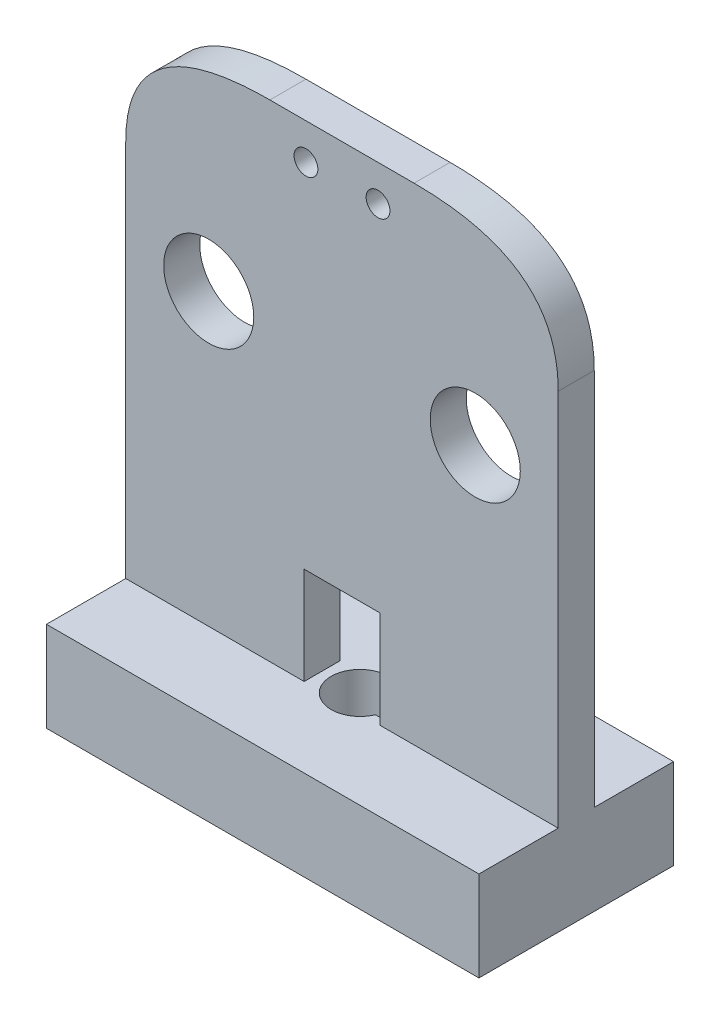
ISO-10303-21;
HEADER;
FILE_DESCRIPTION(('STEP AP214'),'2;1');
FILE_NAME('part.step','',(''),(''),'','','');
FILE_SCHEMA(('AUTOMOTIVE_DESIGN { 1 0 10303 214 1 1 1 1 }'));
ENDSEC;
DATA;
#1=APPLICATION_CONTEXT('core data for automotive mechanical design processes');
#2=APPLICATION_PROTOCOL_DEFINITION('international standard','automotive_design',2000,#1);
#3=PRODUCT_CONTEXT('',#1,'mechanical');
#4=PRODUCT('Part','Part','',(#3));
#5=PRODUCT_RELATED_PRODUCT_CATEGORY('part','',(#4));
#6=PRODUCT_DEFINITION_FORMATION('','',#4);
#7=PRODUCT_DEFINITION_CONTEXT('part definition',#1,'design');
#8=PRODUCT_DEFINITION('design','',#6,#7);
#9=PRODUCT_DEFINITION_SHAPE('','',#8);
#10=(LENGTH_UNIT() NAMED_UNIT(*) SI_UNIT(.MILLI.,.METRE.));
#11=(NAMED_UNIT(*) PLANE_ANGLE_UNIT() SI_UNIT($,.RADIAN.));
#12=(NAMED_UNIT(*) SI_UNIT($,.STERADIAN.) SOLID_ANGLE_UNIT());
#13=UNCERTAINTY_MEASURE_WITH_UNIT(LENGTH_MEASURE(1.E-05),#10,'distance_accuracy_value','');
#14=(GEOMETRIC_REPRESENTATION_CONTEXT(3) GLOBAL_UNCERTAINTY_ASSIGNED_CONTEXT((#13)) GLOBAL_UNIT_ASSIGNED_CONTEXT((#10,
#11,#12)) REPRESENTATION_CONTEXT('',''));
#15=CARTESIAN_POINT('',(0.,0.,0.));
#16=DIRECTION('',(0.,0.,1.));
#17=DIRECTION('',(1.,0.,0.));
#18=AXIS2_PLACEMENT_3D('',#15,#16,#17);
#19=CARTESIAN_POINT('',(0.,0.,5.));
#20=DIRECTION('',(0.,0.,1.));
#21=DIRECTION('',(1.,0.,0.));
#22=AXIS2_PLACEMENT_3D('',#19,#20,#21);
#23=PLANE('',#22);
#24=CARTESIAN_POINT('',(-18.4881047121735,12.7722913625034,5.));
#25=DIRECTION('',(0.,0.,1.));
#26=DIRECTION('',(1.,0.,0.));
#27=AXIS2_PLACEMENT_3D('',#24,#25,#26);
#28=CIRCLE('',#27,6.25);
#29=CARTESIAN_POINT('',(-12.2381047121735,12.7722913625034,5.));
#30=VERTEX_POINT('',#29);
#31=EDGE_CURVE('E455',#30,#30,#28,.T.);
#32=ORIENTED_EDGE('',*,*,#31,.F.);
#33=EDGE_LOOP('',(#32));
#34=FACE_BOUND('',#33,.T.);
#35=CARTESIAN_POINT('',(18.4881047121735,12.7722913625034,5.));
#36=DIRECTION('',(0.,0.,1.));
#37=DIRECTION('',(1.,0.,0.));
#38=AXIS2_PLACEMENT_3D('',#35,#36,#37);
#39=CIRCLE('',#38,6.25);
#40=CARTESIAN_POINT('',(24.7381047121735,12.7722913625034,5.));
#41=VERTEX_POINT('',#40);
#42=EDGE_CURVE('E457',#41,#41,#39,.T.);
#43=ORIENTED_EDGE('',*,*,#42,.F.);
#44=EDGE_LOOP('',(#43));
#45=FACE_BOUND('',#44,.T.);
#46=CARTESIAN_POINT('',(5.,35.,5.));
#47=DIRECTION('',(0.,0.,1.));
#48=DIRECTION('',(1.,0.,0.));
#49=AXIS2_PLACEMENT_3D('',#46,#47,#48);
#50=CIRCLE('',#49,1.65);
#51=CARTESIAN_POINT('',(6.65,35.,5.));
#52=VERTEX_POINT('',#51);
#53=EDGE_CURVE('E462',#52,#52,#50,.T.);
#54=ORIENTED_EDGE('',*,*,#53,.F.);
#55=EDGE_LOOP('',(#54));
#56=FACE_BOUND('',#55,.T.);
#57=CARTESIAN_POINT('',(-5.,35.,5.));
#58=DIRECTION('',(0.,0.,1.));
#59=DIRECTION('',(1.,0.,0.));
#60=AXIS2_PLACEMENT_3D('',#57,#58,#59);
#61=CIRCLE('',#60,1.65);
#62=CARTESIAN_POINT('',(-3.35,35.,5.));
#63=VERTEX_POINT('',#62);
#64=EDGE_CURVE('E215',#63,#63,#61,.T.);
#65=ORIENTED_EDGE('',*,*,#64,.F.);
#66=EDGE_LOOP('',(#65));
#67=FACE_BOUND('',#66,.T.);
#68=DIRECTION('',(-1.,0.,0.));
#69=VECTOR('',#68,1.);
#70=CARTESIAN_POINT('',(0.,-27.5,5.));
#71=LINE('',#70,#69);
#72=CARTESIAN_POINT('',(-5.25,-27.5,5.));
#73=VERTEX_POINT('',#72);
#74=CARTESIAN_POINT('',(-30.,-27.5,5.));
#75=VERTEX_POINT('',#74);
#76=EDGE_CURVE('E477',#73,#75,#71,.T.);
#77=ORIENTED_EDGE('',*,*,#76,.F.);
#78=DIRECTION('',(0.,1.,0.));
#79=VECTOR('',#78,1.);
#80=CARTESIAN_POINT('',(-5.25,0.,5.));
#81=LINE('',#80,#79);
#82=CARTESIAN_POINT('',(-5.25,-14.,5.));
#83=VERTEX_POINT('',#82);
#84=EDGE_CURVE('E182',#73,#83,#81,.T.);
#85=ORIENTED_EDGE('',*,*,#84,.T.);
#86=DIRECTION('',(-1.,0.,0.));
#87=VECTOR('',#86,1.);
#88=CARTESIAN_POINT('',(0.,-14.,5.));
#89=LINE('',#88,#87);
#90=CARTESIAN_POINT('',(5.25,-14.,5.));
#91=VERTEX_POINT('',#90);
#92=EDGE_CURVE('E529',#91,#83,#89,.T.);
#93=ORIENTED_EDGE('',*,*,#92,.F.);
#94=DIRECTION('',(0.,-1.,0.));
#95=VECTOR('',#94,1.);
#96=CARTESIAN_POINT('',(5.25,0.,5.));
#97=LINE('',#96,#95);
#98=CARTESIAN_POINT('',(5.25,-27.5,5.));
#99=VERTEX_POINT('',#98);
#100=EDGE_CURVE('E194',#91,#99,#97,.T.);
#101=ORIENTED_EDGE('',*,*,#100,.T.);
#102=CARTESIAN_POINT('',(30.,-27.5,5.));
#103=VERTEX_POINT('',#102);
#104=EDGE_CURVE('E465',#103,#99,#71,.T.);
#105=ORIENTED_EDGE('',*,*,#104,.F.);
#106=DIRECTION('',(0.,1.,0.));
#107=VECTOR('',#106,1.);
#108=CARTESIAN_POINT('',(30.,0.,5.));
#109=LINE('',#108,#107);
#110=CARTESIAN_POINT('',(30.,25.,5.));
#111=VERTEX_POINT('',#110);
#112=EDGE_CURVE('E211',#103,#111,#109,.T.);
#113=ORIENTED_EDGE('',*,*,#112,.T.);
#114=CARTESIAN_POINT('',(10.,40.,5.));
#115=CARTESIAN_POINT('',(30.,40.,5.));
#116=CARTESIAN_POINT('',(30.,25.,5.));
#117=(BOUNDED_CURVE() B_SPLINE_CURVE(2,(#114,#115,#116),.UNSPECIFIED.,.F.,
.F.) B_SPLINE_CURVE_WITH_KNOTS((3,3),(0.,1.),
.UNSPECIFIED.) CURVE() GEOMETRIC_REPRESENTATION_ITEM() RATIONAL_B_SPLINE_CURVE((1.,1.,1.)) REPRESENTATION_ITEM(''));
#118=CARTESIAN_POINT('',(10.,40.,5.));
#119=VERTEX_POINT('',#118);
#120=EDGE_CURVE('E205',#111,#119,#117,.F.);
#121=ORIENTED_EDGE('',*,*,#120,.T.);
#122=DIRECTION('',(1.,0.,0.));
#123=VECTOR('',#122,1.);
#124=CARTESIAN_POINT('',(0.,40.,5.));
#125=LINE('',#124,#123);
#126=CARTESIAN_POINT('',(-10.,40.,5.));
#127=VERTEX_POINT('',#126);
#128=EDGE_CURVE('E214',#127,#119,#125,.T.);
#129=ORIENTED_EDGE('',*,*,#128,.F.);
#130=CARTESIAN_POINT('',(-30.,25.,5.));
#131=CARTESIAN_POINT('',(-30.,40.,5.));
#132=CARTESIAN_POINT('',(-10.,40.,5.));
#133=(BOUNDED_CURVE() B_SPLINE_CURVE(2,(#130,#131,#132),.UNSPECIFIED.,.F.,
.F.) B_SPLINE_CURVE_WITH_KNOTS((3,3),(0.,1.),
.UNSPECIFIED.) CURVE() GEOMETRIC_REPRESENTATION_ITEM() RATIONAL_B_SPLINE_CURVE((1.,1.,1.)) REPRESENTATION_ITEM(''));
#134=CARTESIAN_POINT('',(-30.,25.,5.));
#135=VERTEX_POINT('',#134);
#136=EDGE_CURVE('E321',#127,#135,#133,.F.);
#137=ORIENTED_EDGE('',*,*,#136,.T.);
#138=DIRECTION('',(0.,1.,0.));
#139=VECTOR('',#138,1.);
#140=CARTESIAN_POINT('',(-30.,0.,5.));
#141=LINE('',#140,#139);
#142=EDGE_CURVE('E216',#75,#135,#141,.T.);
#143=ORIENTED_EDGE('',*,*,#142,.F.);
#144=EDGE_LOOP('',(#77,#85,#93,#101,#105,#113,#121,#129,#137,#143));
#145=FACE_BOUND('',#144,.T.);
#146=ADVANCED_FACE('F46',(#34,#45,#56,#67,#145),#23,.T.);
#147=CARTESIAN_POINT('',(0.,0.,0.));
#148=DIRECTION('',(0.,0.,1.));
#149=DIRECTION('',(1.,0.,0.));
#150=AXIS2_PLACEMENT_3D('',#147,#148,#149);
#151=PLANE('',#150);
#152=CARTESIAN_POINT('',(-5.,35.,0.));
#153=DIRECTION('',(0.,0.,1.));
#154=DIRECTION('',(1.,0.,0.));
#155=AXIS2_PLACEMENT_3D('',#152,#153,#154);
#156=CIRCLE('',#155,1.65);
#157=CARTESIAN_POINT('',(-3.35,35.,0.));
#158=VERTEX_POINT('',#157);
#159=EDGE_CURVE('E441',#158,#158,#156,.T.);
#160=ORIENTED_EDGE('',*,*,#159,.T.);
#161=EDGE_LOOP('',(#160));
#162=FACE_BOUND('',#161,.T.);
#163=CARTESIAN_POINT('',(5.,35.,0.));
#164=DIRECTION('',(0.,0.,1.));
#165=DIRECTION('',(1.,0.,0.));
#166=AXIS2_PLACEMENT_3D('',#163,#164,#165);
#167=CIRCLE('',#166,1.65);
#168=CARTESIAN_POINT('',(6.65,35.,0.));
#169=VERTEX_POINT('',#168);
#170=EDGE_CURVE('E591',#169,#169,#167,.T.);
#171=ORIENTED_EDGE('',*,*,#170,.T.);
#172=EDGE_LOOP('',(#171));
#173=FACE_BOUND('',#172,.T.);
#174=CARTESIAN_POINT('',(18.4881047121735,12.7722913625034,0.));
#175=DIRECTION('',(0.,0.,1.));
#176=DIRECTION('',(1.,0.,0.));
#177=AXIS2_PLACEMENT_3D('',#174,#175,#176);
#178=CIRCLE('',#177,6.25);
#179=CARTESIAN_POINT('',(24.7381047121735,12.7722913625034,0.));
#180=VERTEX_POINT('',#179);
#181=EDGE_CURVE('E589',#180,#180,#178,.T.);
#182=ORIENTED_EDGE('',*,*,#181,.T.);
#183=EDGE_LOOP('',(#182));
#184=FACE_BOUND('',#183,.T.);
#185=CARTESIAN_POINT('',(-18.4881047121735,12.7722913625034,0.));
#186=DIRECTION('',(0.,0.,1.));
#187=DIRECTION('',(1.,0.,0.));
#188=AXIS2_PLACEMENT_3D('',#185,#186,#187);
#189=CIRCLE('',#188,6.25);
#190=CARTESIAN_POINT('',(-12.2381047121735,12.7722913625034,0.));
#191=VERTEX_POINT('',#190);
#192=EDGE_CURVE('E481',#191,#191,#189,.T.);
#193=ORIENTED_EDGE('',*,*,#192,.T.);
#194=EDGE_LOOP('',(#193));
#195=FACE_BOUND('',#194,.T.);
#196=DIRECTION('',(0.,1.,0.));
#197=VECTOR('',#196,1.);
#198=CARTESIAN_POINT('',(-5.25,0.,0.));
#199=LINE('',#198,#197);
#200=CARTESIAN_POINT('',(-5.25,-27.5,0.));
#201=VERTEX_POINT('',#200);
#202=CARTESIAN_POINT('',(-5.25,-14.,0.));
#203=VERTEX_POINT('',#202);
#204=EDGE_CURVE('E179',#201,#203,#199,.T.);
#205=ORIENTED_EDGE('',*,*,#204,.F.);
#206=DIRECTION('',(-1.,0.,0.));
#207=VECTOR('',#206,1.);
#208=CARTESIAN_POINT('',(0.,-27.5,0.));
#209=LINE('',#208,#207);
#210=CARTESIAN_POINT('',(-30.,-27.5,0.));
#211=VERTEX_POINT('',#210);
#212=EDGE_CURVE('E191',#201,#211,#209,.T.);
#213=ORIENTED_EDGE('',*,*,#212,.T.);
#214=DIRECTION('',(0.,1.,0.));
#215=VECTOR('',#214,1.);
#216=CARTESIAN_POINT('',(-30.,0.,0.));
#217=LINE('',#216,#215);
#218=CARTESIAN_POINT('',(-30.,25.,0.));
#219=VERTEX_POINT('',#218);
#220=EDGE_CURVE('E208',#211,#219,#217,.T.);
#221=ORIENTED_EDGE('',*,*,#220,.T.);
#222=CARTESIAN_POINT('',(-10.,40.,0.));
#223=CARTESIAN_POINT('',(-30.,40.,0.));
#224=CARTESIAN_POINT('',(-30.,25.,0.));
#225=(BOUNDED_CURVE() B_SPLINE_CURVE(2,(#222,#223,#224),.UNSPECIFIED.,.F.,
.F.) B_SPLINE_CURVE_WITH_KNOTS((3,3),(0.,1.),
.UNSPECIFIED.) CURVE() GEOMETRIC_REPRESENTATION_ITEM() RATIONAL_B_SPLINE_CURVE((1.,1.,1.)) REPRESENTATION_ITEM(''));
#226=CARTESIAN_POINT('',(-10.,40.,0.));
#227=VERTEX_POINT('',#226);
#228=EDGE_CURVE('E274',#219,#227,#225,.F.);
#229=ORIENTED_EDGE('',*,*,#228,.T.);
#230=DIRECTION('',(1.,0.,0.));
#231=VECTOR('',#230,1.);
#232=CARTESIAN_POINT('',(0.,40.,0.));
#233=LINE('',#232,#231);
#234=CARTESIAN_POINT('',(10.,40.,0.));
#235=VERTEX_POINT('',#234);
#236=EDGE_CURVE('E230',#227,#235,#233,.T.);
#237=ORIENTED_EDGE('',*,*,#236,.T.);
#238=CARTESIAN_POINT('',(30.,25.,0.));
#239=CARTESIAN_POINT('',(30.,40.,0.));
#240=CARTESIAN_POINT('',(9.99999999999999,40.,0.));
#241=(BOUNDED_CURVE() B_SPLINE_CURVE(2,(#238,#239,#240),.UNSPECIFIED.,.F.,
.F.) B_SPLINE_CURVE_WITH_KNOTS((3,3),(0.,1.),
.UNSPECIFIED.) CURVE() GEOMETRIC_REPRESENTATION_ITEM() RATIONAL_B_SPLINE_CURVE((1.,1.,1.)) REPRESENTATION_ITEM(''));
#242=CARTESIAN_POINT('',(30.,25.,0.));
#243=VERTEX_POINT('',#242);
#244=EDGE_CURVE('E353',#235,#243,#241,.F.);
#245=ORIENTED_EDGE('',*,*,#244,.T.);
#246=DIRECTION('',(0.,1.,0.));
#247=VECTOR('',#246,1.);
#248=CARTESIAN_POINT('',(30.,0.,0.));
#249=LINE('',#248,#247);
#250=CARTESIAN_POINT('',(30.,-27.5,0.));
#251=VERTEX_POINT('',#250);
#252=EDGE_CURVE('E434',#251,#243,#249,.T.);
#253=ORIENTED_EDGE('',*,*,#252,.F.);
#254=CARTESIAN_POINT('',(5.25,-27.5,0.));
#255=VERTEX_POINT('',#254);
#256=EDGE_CURVE('E200',#251,#255,#209,.T.);
#257=ORIENTED_EDGE('',*,*,#256,.T.);
#258=DIRECTION('',(0.,-1.,0.));
#259=VECTOR('',#258,1.);
#260=CARTESIAN_POINT('',(5.25,0.,0.));
#261=LINE('',#260,#259);
#262=CARTESIAN_POINT('',(5.25,-14.,0.));
#263=VERTEX_POINT('',#262);
#264=EDGE_CURVE('E534',#263,#255,#261,.T.);
#265=ORIENTED_EDGE('',*,*,#264,.F.);
#266=DIRECTION('',(-1.,0.,0.));
#267=VECTOR('',#266,1.);
#268=CARTESIAN_POINT('',(0.,-14.,0.));
#269=LINE('',#268,#267);
#270=EDGE_CURVE('E12',#263,#203,#269,.T.);
#271=ORIENTED_EDGE('',*,*,#270,.T.);
#272=EDGE_LOOP('',(#205,#213,#221,#229,#237,#245,#253,#257,#265,#271));
#273=FACE_BOUND('',#272,.T.);
#274=ADVANCED_FACE('F190',(#162,#173,#184,#195,#273),#151,.F.);
#275=CARTESIAN_POINT('',(0.,-27.,2.5));
#276=DIRECTION('',(0.,-1.,0.));
#277=DIRECTION('',(0.,0.,-1.));
#278=AXIS2_PLACEMENT_3D('',#275,#276,#277);
#279=CYLINDRICAL_SURFACE('',#278,4.);
#280=DIRECTION('',(0.,-1.,0.));
#281=VECTOR('',#280,1.);
#282=CARTESIAN_POINT('',(3.68747881349846,-27.,0.95));
#283=LINE('',#282,#281);
#284=CARTESIAN_POINT('',(3.68747881349846,-27.5,0.95));
#285=VERTEX_POINT('',#284);
#286=CARTESIAN_POINT('',(3.68747881349846,-40.,0.95));
#287=VERTEX_POINT('',#286);
#288=EDGE_CURVE('E72',#285,#287,#283,.T.);
#289=ORIENTED_EDGE('',*,*,#288,.F.);
#290=CARTESIAN_POINT('',(0.,-27.5,2.5));
#291=DIRECTION('',(0.,1.,0.));
#292=DIRECTION('',(0.,0.,1.));
#293=AXIS2_PLACEMENT_3D('',#290,#291,#292);
#294=CIRCLE('',#293,4.);
#295=CARTESIAN_POINT('',(3.68747881349846,-27.5,4.05));
#296=VERTEX_POINT('',#295);
#297=EDGE_CURVE('E65',#285,#296,#294,.T.);
#298=ORIENTED_EDGE('',*,*,#297,.T.);
#299=DIRECTION('',(0.,-1.,0.));
#300=VECTOR('',#299,1.);
#301=CARTESIAN_POINT('',(3.68747881349846,-27.,4.05));
#302=LINE('',#301,#300);
#303=CARTESIAN_POINT('',(3.68747881349846,-40.,4.05));
#304=VERTEX_POINT('',#303);
#305=EDGE_CURVE('E512',#296,#304,#302,.T.);
#306=ORIENTED_EDGE('',*,*,#305,.T.);
#307=CARTESIAN_POINT('',(0.,-40.,2.5));
#308=DIRECTION('',(0.,-1.,0.));
#309=DIRECTION('',(0.,0.,-1.));
#310=AXIS2_PLACEMENT_3D('',#307,#308,#309);
#311=CIRCLE('',#310,4.);
#312=EDGE_CURVE('E527',#304,#287,#311,.T.);
#313=ORIENTED_EDGE('',*,*,#312,.T.);
#314=EDGE_LOOP('',(#289,#298,#306,#313));
#315=FACE_BOUND('',#314,.T.);
#316=ADVANCED_FACE('F288',(#315),#279,.F.);
#317=CARTESIAN_POINT('',(0.,-27.,4.05));
#318=DIRECTION('',(0.,0.,-1.));
#319=DIRECTION('',(-1.,0.,0.));
#320=AXIS2_PLACEMENT_3D('',#317,#318,#319);
#321=PLANE('',#320);
#322=ORIENTED_EDGE('',*,*,#305,.F.);
#323=DIRECTION('',(1.,0.,0.));
#324=VECTOR('',#323,1.);
#325=CARTESIAN_POINT('',(0.,-27.5,4.05));
#326=LINE('',#325,#324);
#327=CARTESIAN_POINT('',(5.2,-27.5,4.05));
#328=VERTEX_POINT('',#327);
#329=EDGE_CURVE('E536',#296,#328,#326,.T.);
#330=ORIENTED_EDGE('',*,*,#329,.T.);
#331=DIRECTION('',(0.,-1.,0.));
#332=VECTOR('',#331,1.);
#333=CARTESIAN_POINT('',(5.2,-27.,4.05));
#334=LINE('',#333,#332);
#335=CARTESIAN_POINT('',(5.2,-40.,4.05));
#336=VERTEX_POINT('',#335);
#337=EDGE_CURVE('E517',#328,#336,#334,.T.);
#338=ORIENTED_EDGE('',*,*,#337,.T.);
#339=DIRECTION('',(1.,0.,0.));
#340=VECTOR('',#339,1.);
#341=CARTESIAN_POINT('',(0.,-40.,4.05));
#342=LINE('',#341,#340);
#343=EDGE_CURVE('E515',#304,#336,#342,.T.);
#344=ORIENTED_EDGE('',*,*,#343,.F.);
#345=EDGE_LOOP('',(#322,#330,#338,#344));
#346=FACE_BOUND('',#345,.T.);
#347=ADVANCED_FACE('F644',(#346),#321,.T.);
#348=CARTESIAN_POINT('',(5.2,-27.,0.));
#349=DIRECTION('',(1.,0.,0.));
#350=DIRECTION('',(0.,0.,-1.));
#351=AXIS2_PLACEMENT_3D('',#348,#349,#350);
#352=PLANE('',#351);
#353=DIRECTION('',(0.,0.,1.));
#354=VECTOR('',#353,1.);
#355=CARTESIAN_POINT('',(5.2,-27.5,0.));
#356=LINE('',#355,#354);
#357=CARTESIAN_POINT('',(5.2,-27.5,0.95));
#358=VERTEX_POINT('',#357);
#359=EDGE_CURVE('E539',#358,#328,#356,.T.);
#360=ORIENTED_EDGE('',*,*,#359,.F.);
#361=DIRECTION('',(0.,-1.,0.));
#362=VECTOR('',#361,1.);
#363=CARTESIAN_POINT('',(5.2,-27.,0.95));
#364=LINE('',#363,#362);
#365=CARTESIAN_POINT('',(5.2,-40.,0.95));
#366=VERTEX_POINT('',#365);
#367=EDGE_CURVE('E514',#358,#366,#364,.T.);
#368=ORIENTED_EDGE('',*,*,#367,.T.);
#369=DIRECTION('',(0.,0.,1.));
#370=VECTOR('',#369,1.);
#371=CARTESIAN_POINT('',(5.2,-40.,0.));
#372=LINE('',#371,#370);
#373=EDGE_CURVE('E522',#366,#336,#372,.T.);
#374=ORIENTED_EDGE('',*,*,#373,.T.);
#375=ORIENTED_EDGE('',*,*,#337,.F.);
#376=EDGE_LOOP('',(#360,#368,#374,#375));
#377=FACE_BOUND('',#376,.T.);
#378=ADVANCED_FACE('F571',(#377),#352,.F.);
#379=CARTESIAN_POINT('',(0.,-27.,0.95));
#380=DIRECTION('',(0.,0.,-1.));
#381=DIRECTION('',(-1.,0.,0.));
#382=AXIS2_PLACEMENT_3D('',#379,#380,#381);
#383=PLANE('',#382);
#384=DIRECTION('',(1.,0.,0.));
#385=VECTOR('',#384,1.);
#386=CARTESIAN_POINT('',(0.,-27.5,0.95));
#387=LINE('',#386,#385);
#388=EDGE_CURVE('E58',#285,#358,#387,.T.);
#389=ORIENTED_EDGE('',*,*,#388,.F.);
#390=ORIENTED_EDGE('',*,*,#288,.T.);
#391=DIRECTION('',(1.,0.,0.));
#392=VECTOR('',#391,1.);
#393=CARTESIAN_POINT('',(0.,-40.,0.95));
#394=LINE('',#393,#392);
#395=EDGE_CURVE('E525',#287,#366,#394,.T.);
#396=ORIENTED_EDGE('',*,*,#395,.T.);
#397=ORIENTED_EDGE('',*,*,#367,.F.);
#398=EDGE_LOOP('',(#389,#390,#396,#397));
#399=FACE_BOUND('',#398,.T.);
#400=ADVANCED_FACE('F565',(#399),#383,.F.);
#401=CARTESIAN_POINT('',(0.,-40.,5.));
#402=DIRECTION('',(0.,1.,0.));
#403=DIRECTION('',(0.,0.,1.));
#404=AXIS2_PLACEMENT_3D('',#401,#402,#403);
#405=PLANE('',#404);
#406=ORIENTED_EDGE('',*,*,#395,.F.);
#407=ORIENTED_EDGE('',*,*,#312,.F.);
#408=ORIENTED_EDGE('',*,*,#343,.T.);
#409=ORIENTED_EDGE('',*,*,#373,.F.);
#410=EDGE_LOOP('',(#406,#407,#408,#409));
#411=FACE_BOUND('',#410,.T.);
#412=DIRECTION('',(0.,0.,-1.));
#413=VECTOR('',#412,1.);
#414=CARTESIAN_POINT('',(-30.,-40.,5.));
#415=LINE('',#414,#413);
#416=CARTESIAN_POINT('',(-30.,-40.,16.));
#417=VERTEX_POINT('',#416);
#418=CARTESIAN_POINT('',(-30.,-40.,-11.));
#419=VERTEX_POINT('',#418);
#420=EDGE_CURVE('E448',#417,#419,#415,.T.);
#421=ORIENTED_EDGE('',*,*,#420,.T.);
#422=DIRECTION('',(1.,0.,0.));
#423=VECTOR('',#422,1.);
#424=CARTESIAN_POINT('',(-30.,-40.,-11.));
#425=LINE('',#424,#423);
#426=CARTESIAN_POINT('',(30.,-40.,-11.));
#427=VERTEX_POINT('',#426);
#428=EDGE_CURVE('E494',#419,#427,#425,.T.);
#429=ORIENTED_EDGE('',*,*,#428,.T.);
#430=DIRECTION('',(0.,0.,-1.));
#431=VECTOR('',#430,1.);
#432=CARTESIAN_POINT('',(30.,-40.,5.));
#433=LINE('',#432,#431);
#434=CARTESIAN_POINT('',(30.,-40.,16.));
#435=VERTEX_POINT('',#434);
#436=EDGE_CURVE('E449',#435,#427,#433,.T.);
#437=ORIENTED_EDGE('',*,*,#436,.F.);
#438=DIRECTION('',(1.,0.,0.));
#439=VECTOR('',#438,1.);
#440=CARTESIAN_POINT('',(-30.,-40.,16.));
#441=LINE('',#440,#439);
#442=EDGE_CURVE('E506',#417,#435,#441,.T.);
#443=ORIENTED_EDGE('',*,*,#442,.F.);
#444=EDGE_LOOP('',(#421,#429,#437,#443));
#445=FACE_BOUND('',#444,.T.);
#446=ADVANCED_FACE('F558',(#411,#445),#405,.F.);
#447=CARTESIAN_POINT('',(30.,0.,5.));
#448=DIRECTION('',(-1.,0.,0.));
#449=DIRECTION('',(0.,0.,1.));
#450=AXIS2_PLACEMENT_3D('',#447,#448,#449);
#451=PLANE('',#450);
#452=ORIENTED_EDGE('',*,*,#112,.F.);
#453=DIRECTION('',(0.,0.,1.));
#454=VECTOR('',#453,1.);
#455=CARTESIAN_POINT('',(30.,-27.5,-11.));
#456=LINE('',#455,#454);
#457=CARTESIAN_POINT('',(30.,-27.5,16.));
#458=VERTEX_POINT('',#457);
#459=EDGE_CURVE('E489',#103,#458,#456,.T.);
#460=ORIENTED_EDGE('',*,*,#459,.T.);
#461=DIRECTION('',(0.,1.,0.));
#462=VECTOR('',#461,1.);
#463=CARTESIAN_POINT('',(30.,-40.,16.));
#464=LINE('',#463,#462);
#465=EDGE_CURVE('E504',#435,#458,#464,.T.);
#466=ORIENTED_EDGE('',*,*,#465,.F.);
#467=ORIENTED_EDGE('',*,*,#436,.T.);
#468=DIRECTION('',(0.,1.,0.));
#469=VECTOR('',#468,1.);
#470=CARTESIAN_POINT('',(30.,-40.,-11.));
#471=LINE('',#470,#469);
#472=CARTESIAN_POINT('',(30.,-27.5,-11.));
#473=VERTEX_POINT('',#472);
#474=EDGE_CURVE('E492',#427,#473,#471,.T.);
#475=ORIENTED_EDGE('',*,*,#474,.T.);
#476=EDGE_CURVE('E484',#473,#251,#456,.T.);
#477=ORIENTED_EDGE('',*,*,#476,.T.);
#478=ORIENTED_EDGE('',*,*,#252,.T.);
#479=CARTESIAN_POINT('',(30.,25.,5.25));
#480=CARTESIAN_POINT('',(30.,25.,3.41666666666667));
#481=CARTESIAN_POINT('',(30.,25.,1.58333333333333));
#482=CARTESIAN_POINT('',(30.,25.,-0.25));
#483=(BOUNDED_CURVE() B_SPLINE_CURVE(3,(#479,#480,#481,#482),.UNSPECIFIED.,.F.,
.F.) B_SPLINE_CURVE_WITH_KNOTS((4,4),(-0.00525,0.00025),
.UNSPECIFIED.) CURVE() GEOMETRIC_REPRESENTATION_ITEM() RATIONAL_B_SPLINE_CURVE((1.,1.,1.,1.)) REPRESENTATION_ITEM(''));
#484=EDGE_CURVE('E306',#243,#111,#483,.F.);
#485=ORIENTED_EDGE('',*,*,#484,.T.);
#486=EDGE_LOOP('',(#452,#460,#466,#467,#475,#477,#478,#485));
#487=FACE_BOUND('',#486,.T.);
#488=ADVANCED_FACE('F256',(#487),#451,.F.);
#489=CARTESIAN_POINT('',(0.,40.,5.));
#490=DIRECTION('',(0.,1.,0.));
#491=DIRECTION('',(0.,0.,1.));
#492=AXIS2_PLACEMENT_3D('',#489,#490,#491);
#493=PLANE('',#492);
#494=ORIENTED_EDGE('',*,*,#128,.T.);
#495=CARTESIAN_POINT('',(10.,40.,-0.25));
#496=CARTESIAN_POINT('',(10.,40.,1.58333333333333));
#497=CARTESIAN_POINT('',(10.,40.,3.41666666666667));
#498=CARTESIAN_POINT('',(10.,40.,5.25));
#499=(BOUNDED_CURVE() B_SPLINE_CURVE(3,(#495,#496,#497,#498),.UNSPECIFIED.,.F.,
.F.) B_SPLINE_CURVE_WITH_KNOTS((4,4),(-0.00525,0.00025),
.UNSPECIFIED.) CURVE() GEOMETRIC_REPRESENTATION_ITEM() RATIONAL_B_SPLINE_CURVE((1.,1.,1.,1.)) REPRESENTATION_ITEM(''));
#500=EDGE_CURVE('E453',#119,#235,#499,.F.);
#501=ORIENTED_EDGE('',*,*,#500,.T.);
#502=ORIENTED_EDGE('',*,*,#236,.F.);
#503=CARTESIAN_POINT('',(-10.,40.,5.25));
#504=CARTESIAN_POINT('',(-10.,40.,3.41666666666666));
#505=CARTESIAN_POINT('',(-10.,40.,1.58333333333334));
#506=CARTESIAN_POINT('',(-10.,40.,-0.25));
#507=(BOUNDED_CURVE() B_SPLINE_CURVE(3,(#503,#504,#505,#506),.UNSPECIFIED.,.F.,
.F.) B_SPLINE_CURVE_WITH_KNOTS((4,4),(-0.00025,0.00525),
.UNSPECIFIED.) CURVE() GEOMETRIC_REPRESENTATION_ITEM() RATIONAL_B_SPLINE_CURVE((1.,1.,1.,1.)) REPRESENTATION_ITEM(''));
#508=EDGE_CURVE('E237',#227,#127,#507,.F.);
#509=ORIENTED_EDGE('',*,*,#508,.T.);
#510=EDGE_LOOP('',(#494,#501,#502,#509));
#511=FACE_BOUND('',#510,.T.);
#512=ADVANCED_FACE('F245',(#511),#493,.T.);
#513=CARTESIAN_POINT('',(-5.,35.,5.));
#514=DIRECTION('',(0.,0.,-1.));
#515=DIRECTION('',(-1.,0.,0.));
#516=AXIS2_PLACEMENT_3D('',#513,#514,#515);
#517=CYLINDRICAL_SURFACE('',#516,1.65);
#518=ORIENTED_EDGE('',*,*,#64,.T.);
#519=EDGE_LOOP('',(#518));
#520=FACE_BOUND('',#519,.T.);
#521=ORIENTED_EDGE('',*,*,#159,.F.);
#522=EDGE_LOOP('',(#521));
#523=FACE_BOUND('',#522,.T.);
#524=ADVANCED_FACE('F255',(#520,#523),#517,.F.);
#525=CARTESIAN_POINT('',(5.,35.,5.));
#526=DIRECTION('',(0.,0.,-1.));
#527=DIRECTION('',(-1.,0.,0.));
#528=AXIS2_PLACEMENT_3D('',#525,#526,#527);
#529=CYLINDRICAL_SURFACE('',#528,1.65);
#530=ORIENTED_EDGE('',*,*,#53,.T.);
#531=EDGE_LOOP('',(#530));
#532=FACE_BOUND('',#531,.T.);
#533=ORIENTED_EDGE('',*,*,#170,.F.);
#534=EDGE_LOOP('',(#533));
#535=FACE_BOUND('',#534,.T.);
#536=ADVANCED_FACE('F577',(#532,#535),#529,.F.);
#537=CARTESIAN_POINT('',(18.4881047121735,12.7722913625034,5.));
#538=DIRECTION('',(0.,0.,-1.));
#539=DIRECTION('',(-1.,0.,0.));
#540=AXIS2_PLACEMENT_3D('',#537,#538,#539);
#541=CYLINDRICAL_SURFACE('',#540,6.25);
#542=ORIENTED_EDGE('',*,*,#42,.T.);
#543=EDGE_LOOP('',(#542));
#544=FACE_BOUND('',#543,.T.);
#545=ORIENTED_EDGE('',*,*,#181,.F.);
#546=EDGE_LOOP('',(#545));
#547=FACE_BOUND('',#546,.T.);
#548=ADVANCED_FACE('F579',(#544,#547),#541,.F.);
#549=CARTESIAN_POINT('',(-18.4881047121735,12.7722913625034,5.));
#550=DIRECTION('',(0.,0.,-1.));
#551=DIRECTION('',(-1.,0.,0.));
#552=AXIS2_PLACEMENT_3D('',#549,#550,#551);
#553=CYLINDRICAL_SURFACE('',#552,6.25);
#554=ORIENTED_EDGE('',*,*,#31,.T.);
#555=EDGE_LOOP('',(#554));
#556=FACE_BOUND('',#555,.T.);
#557=ORIENTED_EDGE('',*,*,#192,.F.);
#558=EDGE_LOOP('',(#557));
#559=FACE_BOUND('',#558,.T.);
#560=ADVANCED_FACE('F372',(#556,#559),#553,.F.);
#561=CARTESIAN_POINT('',(-30.,0.,5.));
#562=DIRECTION('',(-1.,0.,0.));
#563=DIRECTION('',(0.,0.,1.));
#564=AXIS2_PLACEMENT_3D('',#561,#562,#563);
#565=PLANE('',#564);
#566=ORIENTED_EDGE('',*,*,#220,.F.);
#567=DIRECTION('',(0.,0.,1.));
#568=VECTOR('',#567,1.);
#569=CARTESIAN_POINT('',(-30.,-27.5,-11.));
#570=LINE('',#569,#568);
#571=CARTESIAN_POINT('',(-30.,-27.5,-11.));
#572=VERTEX_POINT('',#571);
#573=EDGE_CURVE('E198',#572,#211,#570,.T.);
#574=ORIENTED_EDGE('',*,*,#573,.F.);
#575=DIRECTION('',(0.,-1.,0.));
#576=VECTOR('',#575,1.);
#577=CARTESIAN_POINT('',(-30.,-40.,-11.));
#578=LINE('',#577,#576);
#579=EDGE_CURVE('E496',#572,#419,#578,.T.);
#580=ORIENTED_EDGE('',*,*,#579,.T.);
#581=ORIENTED_EDGE('',*,*,#420,.F.);
#582=DIRECTION('',(0.,-1.,0.));
#583=VECTOR('',#582,1.);
#584=CARTESIAN_POINT('',(-30.,-40.,16.));
#585=LINE('',#584,#583);
#586=CARTESIAN_POINT('',(-30.,-27.5,16.));
#587=VERTEX_POINT('',#586);
#588=EDGE_CURVE('E509',#587,#417,#585,.T.);
#589=ORIENTED_EDGE('',*,*,#588,.F.);
#590=EDGE_CURVE('E482',#75,#587,#570,.T.);
#591=ORIENTED_EDGE('',*,*,#590,.F.);
#592=ORIENTED_EDGE('',*,*,#142,.T.);
#593=CARTESIAN_POINT('',(-30.,25.,-0.25));
#594=CARTESIAN_POINT('',(-30.,25.,1.58333333333334));
#595=CARTESIAN_POINT('',(-30.,25.,3.41666666666666));
#596=CARTESIAN_POINT('',(-30.,25.,5.25));
#597=(BOUNDED_CURVE() B_SPLINE_CURVE(3,(#593,#594,#595,#596),.UNSPECIFIED.,.F.,
.F.) B_SPLINE_CURVE_WITH_KNOTS((4,4),(-0.00025,0.00525),
.UNSPECIFIED.) CURVE() GEOMETRIC_REPRESENTATION_ITEM() RATIONAL_B_SPLINE_CURVE((1.,1.,1.,1.)) REPRESENTATION_ITEM(''));
#598=EDGE_CURVE('E201',#135,#219,#597,.F.);
#599=ORIENTED_EDGE('',*,*,#598,.T.);
#600=EDGE_LOOP('',(#566,#574,#580,#581,#589,#591,#592,#599));
#601=FACE_BOUND('',#600,.T.);
#602=ADVANCED_FACE('F257',(#601),#565,.T.);
#603=CARTESIAN_POINT('',(30.,25.,-0.25));
#604=CARTESIAN_POINT('',(30.,25.,1.58333333333333));
#605=CARTESIAN_POINT('',(30.,25.,3.41666666666667));
#606=CARTESIAN_POINT('',(30.,25.,5.25));
#607=CARTESIAN_POINT('',(30.,40.,-0.25));
#608=CARTESIAN_POINT('',(30.,40.,1.58333333333333));
#609=CARTESIAN_POINT('',(30.,40.,3.41666666666667));
#610=CARTESIAN_POINT('',(30.,40.,5.25));
#611=CARTESIAN_POINT('',(10.,40.,-0.25));
#612=CARTESIAN_POINT('',(10.,40.,1.58333333333333));
#613=CARTESIAN_POINT('',(10.,40.,3.41666666666667));
#614=CARTESIAN_POINT('',(10.,40.,5.25));
#615=(BOUNDED_SURFACE() B_SPLINE_SURFACE(2,3,((#603,#604,#605,#606),(#607,#608,#609,#610),(#611,
#612,#613,#614)),.UNSPECIFIED.,.F.,.F.,.F.) B_SPLINE_SURFACE_WITH_KNOTS((3,3),(4,4),(0.,1.),
(-0.00525,0.00025),
.UNSPECIFIED.) GEOMETRIC_REPRESENTATION_ITEM() RATIONAL_B_SPLINE_SURFACE(((1.,1.,1.,1.),(1.,1.,
1.,1.),(1.,1.,1.,1.))) REPRESENTATION_ITEM('') SURFACE());
#616=ORIENTED_EDGE('',*,*,#120,.F.);
#617=ORIENTED_EDGE('',*,*,#484,.F.);
#618=ORIENTED_EDGE('',*,*,#244,.F.);
#619=ORIENTED_EDGE('',*,*,#500,.F.);
#620=EDGE_LOOP('',(#616,#617,#618,#619));
#621=FACE_BOUND('',#620,.T.);
#622=ADVANCED_FACE('F359',(#621),#615,.T.);
#623=CARTESIAN_POINT('',(-30.,25.,5.25));
#624=CARTESIAN_POINT('',(-30.,25.,3.41666666666666));
#625=CARTESIAN_POINT('',(-30.,25.,1.58333333333334));
#626=CARTESIAN_POINT('',(-30.,25.,-0.25));
#627=CARTESIAN_POINT('',(-30.,40.,5.25));
#628=CARTESIAN_POINT('',(-30.,40.,3.41666666666666));
#629=CARTESIAN_POINT('',(-30.,40.,1.58333333333334));
#630=CARTESIAN_POINT('',(-30.,40.,-0.25));
#631=CARTESIAN_POINT('',(-10.,40.,5.25));
#632=CARTESIAN_POINT('',(-10.,40.,3.41666666666666));
#633=CARTESIAN_POINT('',(-10.,40.,1.58333333333334));
#634=CARTESIAN_POINT('',(-10.,40.,-0.25));
#635=(BOUNDED_SURFACE() B_SPLINE_SURFACE(2,3,((#623,#624,#625,#626),(#627,#628,#629,#630),(#631,
#632,#633,#634)),.UNSPECIFIED.,.F.,.F.,.F.) B_SPLINE_SURFACE_WITH_KNOTS((3,3),(4,4),(0.,1.),
(-0.00025,0.00525),
.UNSPECIFIED.) GEOMETRIC_REPRESENTATION_ITEM() RATIONAL_B_SPLINE_SURFACE(((1.,1.,1.,1.),(1.,1.,
1.,1.),(1.,1.,1.,1.))) REPRESENTATION_ITEM('') SURFACE());
#636=ORIENTED_EDGE('',*,*,#136,.F.);
#637=ORIENTED_EDGE('',*,*,#508,.F.);
#638=ORIENTED_EDGE('',*,*,#228,.F.);
#639=ORIENTED_EDGE('',*,*,#598,.F.);
#640=EDGE_LOOP('',(#636,#637,#638,#639));
#641=FACE_BOUND('',#640,.T.);
#642=ADVANCED_FACE('F49',(#641),#635,.T.);
#643=CARTESIAN_POINT('',(0.,0.,-11.));
#644=DIRECTION('',(0.,0.,-1.));
#645=DIRECTION('',(-1.,0.,0.));
#646=AXIS2_PLACEMENT_3D('',#643,#644,#645);
#647=PLANE('',#646);
#648=ORIENTED_EDGE('',*,*,#579,.F.);
#649=DIRECTION('',(-1.,0.,0.));
#650=VECTOR('',#649,1.);
#651=CARTESIAN_POINT('',(-30.,-27.5,-11.));
#652=LINE('',#651,#650);
#653=EDGE_CURVE('E486',#473,#572,#652,.T.);
#654=ORIENTED_EDGE('',*,*,#653,.F.);
#655=ORIENTED_EDGE('',*,*,#474,.F.);
#656=ORIENTED_EDGE('',*,*,#428,.F.);
#657=EDGE_LOOP('',(#648,#654,#655,#656));
#658=FACE_BOUND('',#657,.T.);
#659=ADVANCED_FACE('F614',(#658),#647,.T.);
#660=CARTESIAN_POINT('',(-30.,-27.5,-11.));
#661=DIRECTION('',(0.,1.,0.));
#662=DIRECTION('',(0.,0.,1.));
#663=AXIS2_PLACEMENT_3D('',#660,#661,#662);
#664=PLANE('',#663);
#665=ORIENTED_EDGE('',*,*,#329,.F.);
#666=ORIENTED_EDGE('',*,*,#297,.F.);
#667=ORIENTED_EDGE('',*,*,#388,.T.);
#668=ORIENTED_EDGE('',*,*,#359,.T.);
#669=EDGE_LOOP('',(#665,#666,#667,#668));
#670=FACE_BOUND('',#669,.T.);
#671=ORIENTED_EDGE('',*,*,#212,.F.);
#672=DIRECTION('',(0.,0.,1.));
#673=VECTOR('',#672,1.);
#674=CARTESIAN_POINT('',(-5.25,-27.5,-2.75));
#675=LINE('',#674,#673);
#676=EDGE_CURVE('E175',#201,#73,#675,.T.);
#677=ORIENTED_EDGE('',*,*,#676,.T.);
#678=ORIENTED_EDGE('',*,*,#76,.T.);
#679=ORIENTED_EDGE('',*,*,#590,.T.);
#680=DIRECTION('',(-1.,0.,0.));
#681=VECTOR('',#680,1.);
#682=CARTESIAN_POINT('',(-30.,-27.5,16.));
#683=LINE('',#682,#681);
#684=EDGE_CURVE('E501',#458,#587,#683,.T.);
#685=ORIENTED_EDGE('',*,*,#684,.F.);
#686=ORIENTED_EDGE('',*,*,#459,.F.);
#687=ORIENTED_EDGE('',*,*,#104,.T.);
#688=DIRECTION('',(0.,0.,-1.));
#689=VECTOR('',#688,1.);
#690=CARTESIAN_POINT('',(5.25,-27.5,-2.75));
#691=LINE('',#690,#689);
#692=EDGE_CURVE('E186',#99,#255,#691,.T.);
#693=ORIENTED_EDGE('',*,*,#692,.T.);
#694=ORIENTED_EDGE('',*,*,#256,.F.);
#695=ORIENTED_EDGE('',*,*,#476,.F.);
#696=ORIENTED_EDGE('',*,*,#653,.T.);
#697=ORIENTED_EDGE('',*,*,#573,.T.);
#698=EDGE_LOOP('',(#671,#677,#678,#679,#685,#686,#687,#693,#694,#695,#696,#697));
#699=FACE_BOUND('',#698,.T.);
#700=ADVANCED_FACE('F196',(#670,#699),#664,.T.);
#701=CARTESIAN_POINT('',(0.,0.,16.));
#702=DIRECTION('',(0.,0.,-1.));
#703=DIRECTION('',(-1.,0.,0.));
#704=AXIS2_PLACEMENT_3D('',#701,#702,#703);
#705=PLANE('',#704);
#706=ORIENTED_EDGE('',*,*,#588,.T.);
#707=ORIENTED_EDGE('',*,*,#442,.T.);
#708=ORIENTED_EDGE('',*,*,#465,.T.);
#709=ORIENTED_EDGE('',*,*,#684,.T.);
#710=EDGE_LOOP('',(#706,#707,#708,#709));
#711=FACE_BOUND('',#710,.T.);
#712=ADVANCED_FACE('F553',(#711),#705,.F.);
#713=CARTESIAN_POINT('',(0.,-14.,0.));
#714=DIRECTION('',(0.,1.,0.));
#715=DIRECTION('',(0.,0.,1.));
#716=AXIS2_PLACEMENT_3D('',#713,#714,#715);
#717=PLANE('',#716);
#718=ORIENTED_EDGE('',*,*,#92,.T.);
#719=DIRECTION('',(0.,0.,-1.));
#720=VECTOR('',#719,1.);
#721=CARTESIAN_POINT('',(-5.25,-14.,-2.75));
#722=LINE('',#721,#720);
#723=EDGE_CURVE('E187',#83,#203,#722,.T.);
#724=ORIENTED_EDGE('',*,*,#723,.T.);
#725=ORIENTED_EDGE('',*,*,#270,.F.);
#726=DIRECTION('',(0.,0.,1.));
#727=VECTOR('',#726,1.);
#728=CARTESIAN_POINT('',(5.25,-14.,-2.75));
#729=LINE('',#728,#727);
#730=EDGE_CURVE('E544',#263,#91,#729,.T.);
#731=ORIENTED_EDGE('',*,*,#730,.T.);
#732=EDGE_LOOP('',(#718,#724,#725,#731));
#733=FACE_BOUND('',#732,.T.);
#734=ADVANCED_FACE('F548',(#733),#717,.F.);
#735=CARTESIAN_POINT('',(-5.25,-42.3492424049175,-2.75));
#736=DIRECTION('',(1.,0.,0.));
#737=DIRECTION('',(0.,0.,-1.));
#738=AXIS2_PLACEMENT_3D('',#735,#736,#737);
#739=PLANE('',#738);
#740=ORIENTED_EDGE('',*,*,#676,.F.);
#741=ORIENTED_EDGE('',*,*,#204,.T.);
#742=ORIENTED_EDGE('',*,*,#723,.F.);
#743=ORIENTED_EDGE('',*,*,#84,.F.);
#744=EDGE_LOOP('',(#740,#741,#742,#743));
#745=FACE_BOUND('',#744,.T.);
#746=ADVANCED_FACE('F177',(#745),#739,.T.);
#747=CARTESIAN_POINT('',(5.25,-42.3492424049175,-2.75));
#748=DIRECTION('',(-1.,0.,0.));
#749=DIRECTION('',(0.,0.,1.));
#750=AXIS2_PLACEMENT_3D('',#747,#748,#749);
#751=PLANE('',#750);
#752=ORIENTED_EDGE('',*,*,#730,.F.);
#753=ORIENTED_EDGE('',*,*,#264,.T.);
#754=ORIENTED_EDGE('',*,*,#692,.F.);
#755=ORIENTED_EDGE('',*,*,#100,.F.);
#756=EDGE_LOOP('',(#752,#753,#754,#755));
#757=FACE_BOUND('',#756,.T.);
#758=ADVANCED_FACE('F691',(#757),#751,.T.);
#759=CLOSED_SHELL('',(#146,#274,#316,#347,#378,#400,#446,#488,#512,#524,#536,#548,#560,#602,
#622,#642,#659,#700,#712,#734,#746,#758));
#760=MANIFOLD_SOLID_BREP('B2',#759);
#761=ADVANCED_BREP_SHAPE_REPRESENTATION('',(#18,#760),#14);
#762=SHAPE_DEFINITION_REPRESENTATION(#9,#761);
ENDSEC;
END-ISO-10303-21;
